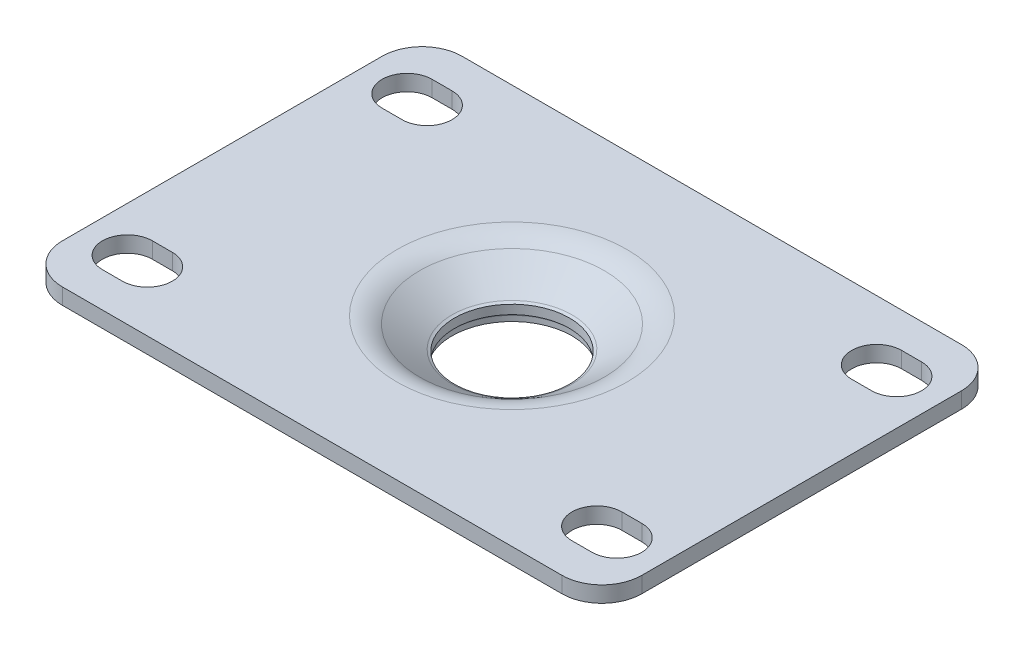
ISO-10303-21;
HEADER;
FILE_DESCRIPTION(('STEP AP214'),'2;1');
FILE_NAME('part.step','',(''),(''),'','','');
FILE_SCHEMA(('AUTOMOTIVE_DESIGN { 1 0 10303 214 1 1 1 1 }'));
ENDSEC;
DATA;
#1=APPLICATION_CONTEXT('core data for automotive mechanical design processes');
#2=APPLICATION_PROTOCOL_DEFINITION('international standard','automotive_design',2000,#1);
#3=PRODUCT_CONTEXT('',#1,'mechanical');
#4=PRODUCT('Part','Part','',(#3));
#5=PRODUCT_RELATED_PRODUCT_CATEGORY('part','',(#4));
#6=PRODUCT_DEFINITION_FORMATION('','',#4);
#7=PRODUCT_DEFINITION_CONTEXT('part definition',#1,'design');
#8=PRODUCT_DEFINITION('design','',#6,#7);
#9=PRODUCT_DEFINITION_SHAPE('','',#8);
#10=(LENGTH_UNIT() NAMED_UNIT(*) SI_UNIT(.MILLI.,.METRE.));
#11=(NAMED_UNIT(*) PLANE_ANGLE_UNIT() SI_UNIT($,.RADIAN.));
#12=(NAMED_UNIT(*) SI_UNIT($,.STERADIAN.) SOLID_ANGLE_UNIT());
#13=UNCERTAINTY_MEASURE_WITH_UNIT(LENGTH_MEASURE(1.E-05),#10,'distance_accuracy_value','');
#14=(GEOMETRIC_REPRESENTATION_CONTEXT(3) GLOBAL_UNCERTAINTY_ASSIGNED_CONTEXT((#13)) GLOBAL_UNIT_ASSIGNED_CONTEXT((#10,
#11,#12)) REPRESENTATION_CONTEXT('',''));
#15=CARTESIAN_POINT('',(0.,0.,0.));
#16=DIRECTION('',(0.,0.,1.));
#17=DIRECTION('',(1.,0.,0.));
#18=AXIS2_PLACEMENT_3D('',#15,#16,#17);
#19=CARTESIAN_POINT('',(19.304,69.85,0.));
#20=DIRECTION('',(0.,1.,0.));
#21=DIRECTION('',(0.,0.,1.));
#22=AXIS2_PLACEMENT_3D('',#19,#20,#21);
#23=PLANE('',#22);
#24=CARTESIAN_POINT('',(0.,69.85,0.));
#25=DIRECTION('',(0.,-1.,0.));
#26=DIRECTION('',(0.,0.,-1.));
#27=AXIS2_PLACEMENT_3D('',#24,#25,#26);
#28=CIRCLE('',#27,18.2626);
#29=CARTESIAN_POINT('',(0.,69.85,-18.2626));
#30=VERTEX_POINT('',#29);
#31=EDGE_CURVE('E11',#30,#30,#28,.T.);
#32=ORIENTED_EDGE('',*,*,#31,.T.);
#33=EDGE_LOOP('',(#32));
#34=FACE_BOUND('',#33,.T.);
#35=CARTESIAN_POINT('',(35.71875,69.85,-22.225));
#36=DIRECTION('',(0.,1.,0.));
#37=DIRECTION('',(0.,0.,-1.));
#38=AXIS2_PLACEMENT_3D('',#35,#36,#37);
#39=CIRCLE('',#38,3.96875);
#40=CARTESIAN_POINT('',(35.71875,69.85,-26.19375));
#41=VERTEX_POINT('',#40);
#42=CARTESIAN_POINT('',(35.71875,69.85,-18.25625));
#43=VERTEX_POINT('',#42);
#44=EDGE_CURVE('E239',#41,#43,#39,.T.);
#45=ORIENTED_EDGE('',*,*,#44,.F.);
#46=DIRECTION('',(-1.,0.,0.));
#47=VECTOR('',#46,1.);
#48=CARTESIAN_POINT('',(35.71875,69.85,-26.19375));
#49=LINE('',#48,#47);
#50=CARTESIAN_POINT('',(38.89375,69.85,-26.19375));
#51=VERTEX_POINT('',#50);
#52=EDGE_CURVE('E247',#51,#41,#49,.T.);
#53=ORIENTED_EDGE('',*,*,#52,.F.);
#54=CARTESIAN_POINT('',(38.89375,69.85,-22.225));
#55=DIRECTION('',(0.,1.,0.));
#56=DIRECTION('',(0.,0.,-1.));
#57=AXIS2_PLACEMENT_3D('',#54,#55,#56);
#58=CIRCLE('',#57,3.96875);
#59=CARTESIAN_POINT('',(38.89375,69.85,-18.25625));
#60=VERTEX_POINT('',#59);
#61=EDGE_CURVE('E244',#60,#51,#58,.T.);
#62=ORIENTED_EDGE('',*,*,#61,.F.);
#63=DIRECTION('',(1.,0.,0.));
#64=VECTOR('',#63,1.);
#65=CARTESIAN_POINT('',(38.89375,69.85,-18.25625));
#66=LINE('',#65,#64);
#67=EDGE_CURVE('E241',#43,#60,#66,.T.);
#68=ORIENTED_EDGE('',*,*,#67,.F.);
#69=EDGE_LOOP('',(#45,#53,#62,#68));
#70=FACE_BOUND('',#69,.T.);
#71=CARTESIAN_POINT('',(-38.89375,69.85,-22.225));
#72=DIRECTION('',(0.,1.,0.));
#73=DIRECTION('',(0.,0.,-1.));
#74=AXIS2_PLACEMENT_3D('',#71,#72,#73);
#75=CIRCLE('',#74,3.96875);
#76=CARTESIAN_POINT('',(-38.89375,69.85,-26.19375));
#77=VERTEX_POINT('',#76);
#78=CARTESIAN_POINT('',(-38.89375,69.85,-18.25625));
#79=VERTEX_POINT('',#78);
#80=EDGE_CURVE('E301',#77,#79,#75,.T.);
#81=ORIENTED_EDGE('',*,*,#80,.F.);
#82=DIRECTION('',(-1.,0.,0.));
#83=VECTOR('',#82,1.);
#84=CARTESIAN_POINT('',(-38.89375,69.85,-26.19375));
#85=LINE('',#84,#83);
#86=CARTESIAN_POINT('',(-35.71875,69.85,-26.19375));
#87=VERTEX_POINT('',#86);
#88=EDGE_CURVE('E309',#87,#77,#85,.T.);
#89=ORIENTED_EDGE('',*,*,#88,.F.);
#90=CARTESIAN_POINT('',(-35.71875,69.85,-22.225));
#91=DIRECTION('',(0.,1.,0.));
#92=DIRECTION('',(0.,0.,-1.));
#93=AXIS2_PLACEMENT_3D('',#90,#91,#92);
#94=CIRCLE('',#93,3.96875);
#95=CARTESIAN_POINT('',(-35.71875,69.85,-18.25625));
#96=VERTEX_POINT('',#95);
#97=EDGE_CURVE('E306',#96,#87,#94,.T.);
#98=ORIENTED_EDGE('',*,*,#97,.F.);
#99=DIRECTION('',(1.,0.,0.));
#100=VECTOR('',#99,1.);
#101=CARTESIAN_POINT('',(-35.71875,69.85,-18.25625));
#102=LINE('',#101,#100);
#103=EDGE_CURVE('E303',#79,#96,#102,.T.);
#104=ORIENTED_EDGE('',*,*,#103,.F.);
#105=EDGE_LOOP('',(#81,#89,#98,#104));
#106=FACE_BOUND('',#105,.T.);
#107=CARTESIAN_POINT('',(-39.6875,69.85,-25.4));
#108=DIRECTION('',(0.,1.,0.));
#109=DIRECTION('',(0.,0.,-1.));
#110=AXIS2_PLACEMENT_3D('',#107,#108,#109);
#111=CIRCLE('',#110,6.34999999999998);
#112=CARTESIAN_POINT('',(-39.6875,69.85,-31.75));
#113=VERTEX_POINT('',#112);
#114=CARTESIAN_POINT('',(-46.0375,69.85,-25.4));
#115=VERTEX_POINT('',#114);
#116=EDGE_CURVE('E332',#113,#115,#111,.T.);
#117=ORIENTED_EDGE('',*,*,#116,.T.);
#118=DIRECTION('',(0.,0.,1.));
#119=VECTOR('',#118,1.);
#120=CARTESIAN_POINT('',(-46.0375,69.85,25.4));
#121=LINE('',#120,#119);
#122=CARTESIAN_POINT('',(-46.0375,69.85,25.4));
#123=VERTEX_POINT('',#122);
#124=EDGE_CURVE('E335',#115,#123,#121,.T.);
#125=ORIENTED_EDGE('',*,*,#124,.T.);
#126=CARTESIAN_POINT('',(-39.6875,69.85,25.4));
#127=DIRECTION('',(0.,1.,0.));
#128=DIRECTION('',(0.,0.,-1.));
#129=AXIS2_PLACEMENT_3D('',#126,#127,#128);
#130=CIRCLE('',#129,6.34999999999998);
#131=CARTESIAN_POINT('',(-39.6875,69.85,31.75));
#132=VERTEX_POINT('',#131);
#133=EDGE_CURVE('E338',#123,#132,#130,.T.);
#134=ORIENTED_EDGE('',*,*,#133,.T.);
#135=DIRECTION('',(1.,0.,0.));
#136=VECTOR('',#135,1.);
#137=CARTESIAN_POINT('',(39.6875,69.85,31.75));
#138=LINE('',#137,#136);
#139=CARTESIAN_POINT('',(39.6875,69.85,31.75));
#140=VERTEX_POINT('',#139);
#141=EDGE_CURVE('E340',#132,#140,#138,.T.);
#142=ORIENTED_EDGE('',*,*,#141,.T.);
#143=CARTESIAN_POINT('',(39.6875,69.85,25.4));
#144=DIRECTION('',(0.,1.,0.));
#145=DIRECTION('',(0.,0.,-1.));
#146=AXIS2_PLACEMENT_3D('',#143,#144,#145);
#147=CIRCLE('',#146,6.34999999999998);
#148=CARTESIAN_POINT('',(46.0375,69.85,25.4));
#149=VERTEX_POINT('',#148);
#150=EDGE_CURVE('E342',#140,#149,#147,.T.);
#151=ORIENTED_EDGE('',*,*,#150,.T.);
#152=DIRECTION('',(0.,0.,-1.));
#153=VECTOR('',#152,1.);
#154=CARTESIAN_POINT('',(46.0375,69.85,-25.4));
#155=LINE('',#154,#153);
#156=CARTESIAN_POINT('',(46.0375,69.85,-25.4));
#157=VERTEX_POINT('',#156);
#158=EDGE_CURVE('E344',#149,#157,#155,.T.);
#159=ORIENTED_EDGE('',*,*,#158,.T.);
#160=CARTESIAN_POINT('',(39.6875,69.85,-25.4));
#161=DIRECTION('',(0.,1.,0.));
#162=DIRECTION('',(0.,0.,-1.));
#163=AXIS2_PLACEMENT_3D('',#160,#161,#162);
#164=CIRCLE('',#163,6.34999999999998);
#165=CARTESIAN_POINT('',(39.6875,69.85,-31.75));
#166=VERTEX_POINT('',#165);
#167=EDGE_CURVE('E346',#157,#166,#164,.T.);
#168=ORIENTED_EDGE('',*,*,#167,.T.);
#169=DIRECTION('',(-1.,0.,0.));
#170=VECTOR('',#169,1.);
#171=CARTESIAN_POINT('',(-39.6875,69.85,-31.75));
#172=LINE('',#171,#170);
#173=EDGE_CURVE('E348',#166,#113,#172,.T.);
#174=ORIENTED_EDGE('',*,*,#173,.T.);
#175=EDGE_LOOP('',(#117,#125,#134,#142,#151,#159,#168,#174));
#176=FACE_BOUND('',#175,.T.);
#177=CARTESIAN_POINT('',(-38.89375,69.85,22.225));
#178=DIRECTION('',(0.,1.,0.));
#179=DIRECTION('',(0.,0.,-1.));
#180=AXIS2_PLACEMENT_3D('',#177,#178,#179);
#181=CIRCLE('',#180,3.96875);
#182=CARTESIAN_POINT('',(-38.89375,69.85,18.25625));
#183=VERTEX_POINT('',#182);
#184=CARTESIAN_POINT('',(-38.89375,69.85,26.19375));
#185=VERTEX_POINT('',#184);
#186=EDGE_CURVE('E270',#183,#185,#181,.T.);
#187=ORIENTED_EDGE('',*,*,#186,.F.);
#188=DIRECTION('',(-1.,0.,0.));
#189=VECTOR('',#188,1.);
#190=CARTESIAN_POINT('',(-38.89375,69.85,18.25625));
#191=LINE('',#190,#189);
#192=CARTESIAN_POINT('',(-35.71875,69.85,18.25625));
#193=VERTEX_POINT('',#192);
#194=EDGE_CURVE('E278',#193,#183,#191,.T.);
#195=ORIENTED_EDGE('',*,*,#194,.F.);
#196=CARTESIAN_POINT('',(-35.71875,69.85,22.225));
#197=DIRECTION('',(0.,1.,0.));
#198=DIRECTION('',(0.,0.,-1.));
#199=AXIS2_PLACEMENT_3D('',#196,#197,#198);
#200=CIRCLE('',#199,3.96875);
#201=CARTESIAN_POINT('',(-35.71875,69.85,26.19375));
#202=VERTEX_POINT('',#201);
#203=EDGE_CURVE('E275',#202,#193,#200,.T.);
#204=ORIENTED_EDGE('',*,*,#203,.F.);
#205=DIRECTION('',(1.,0.,0.));
#206=VECTOR('',#205,1.);
#207=CARTESIAN_POINT('',(-35.71875,69.85,26.19375));
#208=LINE('',#207,#206);
#209=EDGE_CURVE('E272',#185,#202,#208,.T.);
#210=ORIENTED_EDGE('',*,*,#209,.F.);
#211=EDGE_LOOP('',(#187,#195,#204,#210));
#212=FACE_BOUND('',#211,.T.);
#213=CARTESIAN_POINT('',(35.71875,69.85,22.225));
#214=DIRECTION('',(0.,1.,0.));
#215=DIRECTION('',(0.,0.,-1.));
#216=AXIS2_PLACEMENT_3D('',#213,#214,#215);
#217=CIRCLE('',#216,3.96875);
#218=CARTESIAN_POINT('',(35.71875,69.85,18.25625));
#219=VERTEX_POINT('',#218);
#220=CARTESIAN_POINT('',(35.71875,69.85,26.19375));
#221=VERTEX_POINT('',#220);
#222=EDGE_CURVE('E203',#219,#221,#217,.T.);
#223=ORIENTED_EDGE('',*,*,#222,.F.);
#224=DIRECTION('',(-1.,0.,0.));
#225=VECTOR('',#224,1.);
#226=CARTESIAN_POINT('',(35.71875,69.85,18.25625));
#227=LINE('',#226,#225);
#228=CARTESIAN_POINT('',(38.89375,69.85,18.25625));
#229=VERTEX_POINT('',#228);
#230=EDGE_CURVE('E225',#229,#219,#227,.T.);
#231=ORIENTED_EDGE('',*,*,#230,.F.);
#232=CARTESIAN_POINT('',(38.89375,69.85,22.225));
#233=DIRECTION('',(0.,1.,0.));
#234=DIRECTION('',(0.,0.,-1.));
#235=AXIS2_PLACEMENT_3D('',#232,#233,#234);
#236=CIRCLE('',#235,3.96875);
#237=CARTESIAN_POINT('',(38.89375,69.85,26.19375));
#238=VERTEX_POINT('',#237);
#239=EDGE_CURVE('E223',#238,#229,#236,.T.);
#240=ORIENTED_EDGE('',*,*,#239,.F.);
#241=DIRECTION('',(1.,0.,0.));
#242=VECTOR('',#241,1.);
#243=CARTESIAN_POINT('',(38.89375,69.85,26.19375));
#244=LINE('',#243,#242);
#245=EDGE_CURVE('E211',#221,#238,#244,.T.);
#246=ORIENTED_EDGE('',*,*,#245,.F.);
#247=EDGE_LOOP('',(#223,#231,#240,#246));
#248=FACE_BOUND('',#247,.T.);
#249=ADVANCED_FACE('F43',(#34,#70,#106,#176,#212,#248),#23,.T.);
#250=CARTESIAN_POINT('',(0.,63.5067036743865,0.));
#251=DIRECTION('',(0.,-1.,0.));
#252=DIRECTION('',(0.,0.,-1.));
#253=AXIS2_PLACEMENT_3D('',#250,#251,#252);
#254=TOROIDAL_SURFACE('',#253,18.2615842384733,6.34329640694123);
#255=CARTESIAN_POINT('',(0.,68.73494,0.));
#256=DIRECTION('',(0.,-1.,0.));
#257=DIRECTION('',(0.,0.,-1.));
#258=AXIS2_PLACEMENT_3D('',#255,#256,#257);
#259=CIRCLE('',#258,14.669516);
#260=CARTESIAN_POINT('',(0.,68.73494,-14.669516));
#261=VERTEX_POINT('',#260);
#262=EDGE_CURVE('E50',#261,#261,#259,.T.);
#263=ORIENTED_EDGE('',*,*,#262,.T.);
#264=EDGE_LOOP('',(#263));
#265=FACE_BOUND('',#264,.T.);
#266=ORIENTED_EDGE('',*,*,#31,.F.);
#267=EDGE_LOOP('',(#266));
#268=FACE_BOUND('',#267,.T.);
#269=ADVANCED_FACE('F418',(#265,#268),#254,.T.);
#270=CARTESIAN_POINT('',(0.,68.73494,0.));
#271=DIRECTION('',(0.,1.,0.));
#272=DIRECTION('',(0.,0.,1.));
#273=AXIS2_PLACEMENT_3D('',#270,#271,#272);
#274=CONICAL_SURFACE('',#273,14.669516,0.969295415131203);
#275=CARTESIAN_POINT('',(0.,65.2145,0.));
#276=DIRECTION('',(0.,-1.,0.));
#277=DIRECTION('',(0.,0.,-1.));
#278=AXIS2_PLACEMENT_3D('',#275,#276,#277);
#279=CIRCLE('',#278,9.54024);
#280=CARTESIAN_POINT('',(0.,65.2145,-9.54024));
#281=VERTEX_POINT('',#280);
#282=EDGE_CURVE('E413',#281,#281,#279,.T.);
#283=ORIENTED_EDGE('',*,*,#282,.T.);
#284=EDGE_LOOP('',(#283));
#285=FACE_BOUND('',#284,.T.);
#286=ORIENTED_EDGE('',*,*,#262,.F.);
#287=EDGE_LOOP('',(#286));
#288=FACE_BOUND('',#287,.T.);
#289=ADVANCED_FACE('F421',(#285,#288),#274,.F.);
#290=CARTESIAN_POINT('',(0.,67.1278815066508,0.));
#291=DIRECTION('',(0.,-1.,0.));
#292=DIRECTION('',(0.,0.,-1.));
#293=AXIS2_PLACEMENT_3D('',#290,#291,#292);
#294=TOROIDAL_SURFACE('',#293,8.21557978824899,2.32717714551119);
#295=CARTESIAN_POINT('',(0.,64.98844,0.));
#296=DIRECTION('',(0.,-1.,0.));
#297=DIRECTION('',(0.,0.,-1.));
#298=AXIS2_PLACEMENT_3D('',#295,#296,#297);
#299=CIRCLE('',#298,9.1313);
#300=CARTESIAN_POINT('',(0.,64.98844,-9.1313));
#301=VERTEX_POINT('',#300);
#302=EDGE_CURVE('E410',#301,#301,#299,.T.);
#303=ORIENTED_EDGE('',*,*,#302,.T.);
#304=EDGE_LOOP('',(#303));
#305=FACE_BOUND('',#304,.T.);
#306=ORIENTED_EDGE('',*,*,#282,.F.);
#307=EDGE_LOOP('',(#306));
#308=FACE_BOUND('',#307,.T.);
#309=ADVANCED_FACE('F423',(#305,#308),#294,.F.);
#310=CARTESIAN_POINT('',(0.,-25.4,0.));
#311=DIRECTION('',(0.,-1.,0.));
#312=DIRECTION('',(0.,0.,-1.));
#313=AXIS2_PLACEMENT_3D('',#310,#311,#312);
#314=CYLINDRICAL_SURFACE('',#313,9.1313);
#315=CARTESIAN_POINT('',(0.,63.5508,0.));
#316=DIRECTION('',(0.,-1.,0.));
#317=DIRECTION('',(0.,0.,-1.));
#318=AXIS2_PLACEMENT_3D('',#315,#316,#317);
#319=CIRCLE('',#318,9.1313);
#320=CARTESIAN_POINT('',(0.,63.5508,-9.1313));
#321=VERTEX_POINT('',#320);
#322=EDGE_CURVE('E407',#321,#321,#319,.T.);
#323=ORIENTED_EDGE('',*,*,#322,.T.);
#324=EDGE_LOOP('',(#323));
#325=FACE_BOUND('',#324,.T.);
#326=ORIENTED_EDGE('',*,*,#302,.F.);
#327=EDGE_LOOP('',(#326));
#328=FACE_BOUND('',#327,.T.);
#329=ADVANCED_FACE('F430',(#325,#328),#314,.F.);
#330=CARTESIAN_POINT('',(9.1313,63.5508,0.));
#331=DIRECTION('',(0.,-1.,0.));
#332=DIRECTION('',(0.,0.,-1.));
#333=AXIS2_PLACEMENT_3D('',#330,#331,#332);
#334=PLANE('',#333);
#335=CARTESIAN_POINT('',(0.,63.5508,0.));
#336=DIRECTION('',(0.,-1.,0.));
#337=DIRECTION('',(0.,0.,-1.));
#338=AXIS2_PLACEMENT_3D('',#335,#336,#337);
#339=CIRCLE('',#338,9.1567);
#340=CARTESIAN_POINT('',(0.,63.5508,-9.1567));
#341=VERTEX_POINT('',#340);
#342=EDGE_CURVE('E404',#341,#341,#339,.T.);
#343=ORIENTED_EDGE('',*,*,#342,.T.);
#344=EDGE_LOOP('',(#343));
#345=FACE_BOUND('',#344,.T.);
#346=ORIENTED_EDGE('',*,*,#322,.F.);
#347=EDGE_LOOP('',(#346));
#348=FACE_BOUND('',#347,.T.);
#349=ADVANCED_FACE('F553',(#345,#348),#334,.T.);
#350=CARTESIAN_POINT('',(0.,63.1698,0.));
#351=DIRECTION('',(0.,-1.,0.));
#352=DIRECTION('',(0.,0.,-1.));
#353=AXIS2_PLACEMENT_3D('',#350,#351,#352);
#354=TOROIDAL_SURFACE('',#353,9.15669999999999,0.381000000000009);
#355=CARTESIAN_POINT('',(0.,63.1698,0.));
#356=DIRECTION('',(0.,-1.,0.));
#357=DIRECTION('',(0.,0.,-1.));
#358=AXIS2_PLACEMENT_3D('',#355,#356,#357);
#359=CIRCLE('',#358,9.5377);
#360=CARTESIAN_POINT('',(0.,63.1698,-9.5377));
#361=VERTEX_POINT('',#360);
#362=EDGE_CURVE('E401',#361,#361,#359,.T.);
#363=ORIENTED_EDGE('',*,*,#362,.T.);
#364=EDGE_LOOP('',(#363));
#365=FACE_BOUND('',#364,.T.);
#366=ORIENTED_EDGE('',*,*,#342,.F.);
#367=EDGE_LOOP('',(#366));
#368=FACE_BOUND('',#367,.T.);
#369=ADVANCED_FACE('F549',(#365,#368),#354,.F.);
#370=CARTESIAN_POINT('',(0.,-25.4,0.));
#371=DIRECTION('',(0.,-1.,0.));
#372=DIRECTION('',(0.,0.,-1.));
#373=AXIS2_PLACEMENT_3D('',#370,#371,#372);
#374=CYLINDRICAL_SURFACE('',#373,9.5377);
#375=CARTESIAN_POINT('',(0.,62.31382,0.));
#376=DIRECTION('',(0.,-1.,0.));
#377=DIRECTION('',(0.,0.,-1.));
#378=AXIS2_PLACEMENT_3D('',#375,#376,#377);
#379=CIRCLE('',#378,9.5377);
#380=CARTESIAN_POINT('',(0.,62.31382,-9.5377));
#381=VERTEX_POINT('',#380);
#382=EDGE_CURVE('E398',#381,#381,#379,.T.);
#383=ORIENTED_EDGE('',*,*,#382,.T.);
#384=EDGE_LOOP('',(#383));
#385=FACE_BOUND('',#384,.T.);
#386=ORIENTED_EDGE('',*,*,#362,.F.);
#387=EDGE_LOOP('',(#386));
#388=FACE_BOUND('',#387,.T.);
#389=ADVANCED_FACE('F545',(#385,#388),#374,.F.);
#390=CARTESIAN_POINT('',(0.,64.8058768731521,0.));
#391=DIRECTION('',(0.,-1.,0.));
#392=DIRECTION('',(0.,0.,-1.));
#393=AXIS2_PLACEMENT_3D('',#390,#391,#392);
#394=TOROIDAL_SURFACE('',#393,8.87715940196917,2.57811197209729);
#395=CARTESIAN_POINT('',(0.,62.6745,0.));
#396=DIRECTION('',(0.,-1.,0.));
#397=DIRECTION('',(0.,0.,-1.));
#398=AXIS2_PLACEMENT_3D('',#395,#396,#397);
#399=CIRCLE('',#398,10.32764);
#400=CARTESIAN_POINT('',(0.,62.6745,-10.32764));
#401=VERTEX_POINT('',#400);
#402=EDGE_CURVE('E395',#401,#401,#399,.T.);
#403=ORIENTED_EDGE('',*,*,#402,.T.);
#404=EDGE_LOOP('',(#403));
#405=FACE_BOUND('',#404,.T.);
#406=ORIENTED_EDGE('',*,*,#382,.F.);
#407=EDGE_LOOP('',(#406));
#408=FACE_BOUND('',#407,.T.);
#409=ADVANCED_FACE('F541',(#405,#408),#394,.T.);
#410=CARTESIAN_POINT('',(0.,62.6745,0.));
#411=DIRECTION('',(0.,1.,0.));
#412=DIRECTION('',(0.,0.,1.));
#413=AXIS2_PLACEMENT_3D('',#410,#411,#412);
#414=CONICAL_SURFACE('',#413,10.32764,0.969318518310585);
#415=CARTESIAN_POINT('',(0.,66.19494,0.));
#416=DIRECTION('',(0.,-1.,0.));
#417=DIRECTION('',(0.,0.,-1.));
#418=AXIS2_PLACEMENT_3D('',#415,#416,#417);
#419=CIRCLE('',#418,15.45717);
#420=CARTESIAN_POINT('',(0.,66.19494,-15.45717));
#421=VERTEX_POINT('',#420);
#422=EDGE_CURVE('E392',#421,#421,#419,.T.);
#423=ORIENTED_EDGE('',*,*,#422,.T.);
#424=EDGE_LOOP('',(#423));
#425=FACE_BOUND('',#424,.T.);
#426=ORIENTED_EDGE('',*,*,#402,.F.);
#427=EDGE_LOOP('',(#426));
#428=FACE_BOUND('',#427,.T.);
#429=ADVANCED_FACE('F537',(#425,#428),#414,.T.);
#430=CARTESIAN_POINT('',(0.,60.9524243235229,0.));
#431=DIRECTION('',(0.,-1.,0.));
#432=DIRECTION('',(0.,0.,-1.));
#433=AXIS2_PLACEMENT_3D('',#430,#431,#432);
#434=TOROIDAL_SURFACE('',#433,19.0536698723743,6.35757673568286);
#435=CARTESIAN_POINT('',(0.,67.31,0.));
#436=DIRECTION('',(0.,-1.,0.));
#437=DIRECTION('',(0.,0.,-1.));
#438=AXIS2_PLACEMENT_3D('',#435,#436,#437);
#439=CIRCLE('',#438,19.05);
#440=CARTESIAN_POINT('',(0.,67.31,-19.05));
#441=VERTEX_POINT('',#440);
#442=EDGE_CURVE('E389',#441,#441,#439,.T.);
#443=ORIENTED_EDGE('',*,*,#442,.T.);
#444=EDGE_LOOP('',(#443));
#445=FACE_BOUND('',#444,.T.);
#446=ORIENTED_EDGE('',*,*,#422,.F.);
#447=EDGE_LOOP('',(#446));
#448=FACE_BOUND('',#447,.T.);
#449=ADVANCED_FACE('F534',(#445,#448),#434,.F.);
#450=CARTESIAN_POINT('',(19.05,67.31,0.));
#451=DIRECTION('',(0.,-1.,0.));
#452=DIRECTION('',(0.,0.,-1.));
#453=AXIS2_PLACEMENT_3D('',#450,#451,#452);
#454=PLANE('',#453);
#455=ORIENTED_EDGE('',*,*,#442,.F.);
#456=EDGE_LOOP('',(#455));
#457=FACE_BOUND('',#456,.T.);
#458=CARTESIAN_POINT('',(-39.6875,67.31,-25.4));
#459=DIRECTION('',(0.,1.,0.));
#460=DIRECTION('',(0.,0.,-1.));
#461=AXIS2_PLACEMENT_3D('',#458,#459,#460);
#462=CIRCLE('',#461,6.34999999999998);
#463=CARTESIAN_POINT('',(-39.6875,67.31,-31.75));
#464=VERTEX_POINT('',#463);
#465=CARTESIAN_POINT('',(-46.0375,67.31,-25.4));
#466=VERTEX_POINT('',#465);
#467=EDGE_CURVE('E331',#464,#466,#462,.T.);
#468=ORIENTED_EDGE('',*,*,#467,.F.);
#469=DIRECTION('',(-1.,0.,0.));
#470=VECTOR('',#469,1.);
#471=CARTESIAN_POINT('',(-39.6875,67.31,-31.75));
#472=LINE('',#471,#470);
#473=CARTESIAN_POINT('',(39.6875,67.31,-31.75));
#474=VERTEX_POINT('',#473);
#475=EDGE_CURVE('E336',#474,#464,#472,.T.);
#476=ORIENTED_EDGE('',*,*,#475,.F.);
#477=CARTESIAN_POINT('',(39.6875,67.31,-25.4));
#478=DIRECTION('',(0.,1.,0.));
#479=DIRECTION('',(0.,0.,-1.));
#480=AXIS2_PLACEMENT_3D('',#477,#478,#479);
#481=CIRCLE('',#480,6.34999999999998);
#482=CARTESIAN_POINT('',(46.0375,67.31,-25.4));
#483=VERTEX_POINT('',#482);
#484=EDGE_CURVE('E363',#483,#474,#481,.T.);
#485=ORIENTED_EDGE('',*,*,#484,.F.);
#486=DIRECTION('',(0.,0.,-1.));
#487=VECTOR('',#486,1.);
#488=CARTESIAN_POINT('',(46.0375,67.31,-25.4));
#489=LINE('',#488,#487);
#490=CARTESIAN_POINT('',(46.0375,67.31,25.4));
#491=VERTEX_POINT('',#490);
#492=EDGE_CURVE('E361',#491,#483,#489,.T.);
#493=ORIENTED_EDGE('',*,*,#492,.F.);
#494=CARTESIAN_POINT('',(39.6875,67.31,25.4));
#495=DIRECTION('',(0.,1.,0.));
#496=DIRECTION('',(0.,0.,-1.));
#497=AXIS2_PLACEMENT_3D('',#494,#495,#496);
#498=CIRCLE('',#497,6.34999999999998);
#499=CARTESIAN_POINT('',(39.6875,67.31,31.75));
#500=VERTEX_POINT('',#499);
#501=EDGE_CURVE('E359',#500,#491,#498,.T.);
#502=ORIENTED_EDGE('',*,*,#501,.F.);
#503=DIRECTION('',(1.,0.,0.));
#504=VECTOR('',#503,1.);
#505=CARTESIAN_POINT('',(39.6875,67.31,31.75));
#506=LINE('',#505,#504);
#507=CARTESIAN_POINT('',(-39.6875,67.31,31.75));
#508=VERTEX_POINT('',#507);
#509=EDGE_CURVE('E357',#508,#500,#506,.T.);
#510=ORIENTED_EDGE('',*,*,#509,.F.);
#511=CARTESIAN_POINT('',(-39.6875,67.31,25.4));
#512=DIRECTION('',(0.,1.,0.));
#513=DIRECTION('',(0.,0.,-1.));
#514=AXIS2_PLACEMENT_3D('',#511,#512,#513);
#515=CIRCLE('',#514,6.34999999999998);
#516=CARTESIAN_POINT('',(-46.0375,67.31,25.4));
#517=VERTEX_POINT('',#516);
#518=EDGE_CURVE('E355',#517,#508,#515,.T.);
#519=ORIENTED_EDGE('',*,*,#518,.F.);
#520=DIRECTION('',(0.,0.,1.));
#521=VECTOR('',#520,1.);
#522=CARTESIAN_POINT('',(-46.0375,67.31,25.4));
#523=LINE('',#522,#521);
#524=EDGE_CURVE('E353',#466,#517,#523,.T.);
#525=ORIENTED_EDGE('',*,*,#524,.F.);
#526=EDGE_LOOP('',(#468,#476,#485,#493,#502,#510,#519,#525));
#527=FACE_BOUND('',#526,.T.);
#528=DIRECTION('',(-1.,0.,0.));
#529=VECTOR('',#528,1.);
#530=CARTESIAN_POINT('',(-38.89375,67.31,-26.19375));
#531=LINE('',#530,#529);
#532=CARTESIAN_POINT('',(-35.71875,67.31,-26.19375));
#533=VERTEX_POINT('',#532);
#534=CARTESIAN_POINT('',(-38.89375,67.31,-26.19375));
#535=VERTEX_POINT('',#534);
#536=EDGE_CURVE('E304',#533,#535,#531,.T.);
#537=ORIENTED_EDGE('',*,*,#536,.T.);
#538=CARTESIAN_POINT('',(-38.89375,67.31,-22.225));
#539=DIRECTION('',(0.,1.,0.));
#540=DIRECTION('',(0.,0.,-1.));
#541=AXIS2_PLACEMENT_3D('',#538,#539,#540);
#542=CIRCLE('',#541,3.96875);
#543=CARTESIAN_POINT('',(-38.89375,67.31,-18.25625));
#544=VERTEX_POINT('',#543);
#545=EDGE_CURVE('E300',#535,#544,#542,.T.);
#546=ORIENTED_EDGE('',*,*,#545,.T.);
#547=DIRECTION('',(1.,0.,0.));
#548=VECTOR('',#547,1.);
#549=CARTESIAN_POINT('',(-35.71875,67.31,-18.25625));
#550=LINE('',#549,#548);
#551=CARTESIAN_POINT('',(-35.71875,67.31,-18.25625));
#552=VERTEX_POINT('',#551);
#553=EDGE_CURVE('E314',#544,#552,#550,.T.);
#554=ORIENTED_EDGE('',*,*,#553,.T.);
#555=CARTESIAN_POINT('',(-35.71875,67.31,-22.225));
#556=DIRECTION('',(0.,1.,0.));
#557=DIRECTION('',(0.,0.,-1.));
#558=AXIS2_PLACEMENT_3D('',#555,#556,#557);
#559=CIRCLE('',#558,3.96875);
#560=EDGE_CURVE('E317',#552,#533,#559,.T.);
#561=ORIENTED_EDGE('',*,*,#560,.T.);
#562=EDGE_LOOP('',(#537,#546,#554,#561));
#563=FACE_BOUND('',#562,.T.);
#564=DIRECTION('',(-1.,0.,0.));
#565=VECTOR('',#564,1.);
#566=CARTESIAN_POINT('',(-38.89375,67.31,18.25625));
#567=LINE('',#566,#565);
#568=CARTESIAN_POINT('',(-35.71875,67.31,18.25625));
#569=VERTEX_POINT('',#568);
#570=CARTESIAN_POINT('',(-38.89375,67.31,18.25625));
#571=VERTEX_POINT('',#570);
#572=EDGE_CURVE('E273',#569,#571,#567,.T.);
#573=ORIENTED_EDGE('',*,*,#572,.T.);
#574=CARTESIAN_POINT('',(-38.89375,67.31,22.225));
#575=DIRECTION('',(0.,1.,0.));
#576=DIRECTION('',(0.,0.,-1.));
#577=AXIS2_PLACEMENT_3D('',#574,#575,#576);
#578=CIRCLE('',#577,3.96875);
#579=CARTESIAN_POINT('',(-38.89375,67.31,26.19375));
#580=VERTEX_POINT('',#579);
#581=EDGE_CURVE('E269',#571,#580,#578,.T.);
#582=ORIENTED_EDGE('',*,*,#581,.T.);
#583=DIRECTION('',(1.,0.,0.));
#584=VECTOR('',#583,1.);
#585=CARTESIAN_POINT('',(-35.71875,67.31,26.19375));
#586=LINE('',#585,#584);
#587=CARTESIAN_POINT('',(-35.71875,67.31,26.19375));
#588=VERTEX_POINT('',#587);
#589=EDGE_CURVE('E283',#580,#588,#586,.T.);
#590=ORIENTED_EDGE('',*,*,#589,.T.);
#591=CARTESIAN_POINT('',(-35.71875,67.31,22.225));
#592=DIRECTION('',(0.,1.,0.));
#593=DIRECTION('',(0.,0.,-1.));
#594=AXIS2_PLACEMENT_3D('',#591,#592,#593);
#595=CIRCLE('',#594,3.96875);
#596=EDGE_CURVE('E286',#588,#569,#595,.T.);
#597=ORIENTED_EDGE('',*,*,#596,.T.);
#598=EDGE_LOOP('',(#573,#582,#590,#597));
#599=FACE_BOUND('',#598,.T.);
#600=DIRECTION('',(-1.,0.,0.));
#601=VECTOR('',#600,1.);
#602=CARTESIAN_POINT('',(35.71875,67.31,-26.19375));
#603=LINE('',#602,#601);
#604=CARTESIAN_POINT('',(38.89375,67.31,-26.19375));
#605=VERTEX_POINT('',#604);
#606=CARTESIAN_POINT('',(35.71875,67.31,-26.19375));
#607=VERTEX_POINT('',#606);
#608=EDGE_CURVE('E242',#605,#607,#603,.T.);
#609=ORIENTED_EDGE('',*,*,#608,.T.);
#610=CARTESIAN_POINT('',(35.71875,67.31,-22.225));
#611=DIRECTION('',(0.,1.,0.));
#612=DIRECTION('',(0.,0.,-1.));
#613=AXIS2_PLACEMENT_3D('',#610,#611,#612);
#614=CIRCLE('',#613,3.96875);
#615=CARTESIAN_POINT('',(35.71875,67.31,-18.25625));
#616=VERTEX_POINT('',#615);
#617=EDGE_CURVE('E219',#607,#616,#614,.T.);
#618=ORIENTED_EDGE('',*,*,#617,.T.);
#619=DIRECTION('',(1.,0.,0.));
#620=VECTOR('',#619,1.);
#621=CARTESIAN_POINT('',(38.89375,67.31,-18.25625));
#622=LINE('',#621,#620);
#623=CARTESIAN_POINT('',(38.89375,67.31,-18.25625));
#624=VERTEX_POINT('',#623);
#625=EDGE_CURVE('E252',#616,#624,#622,.T.);
#626=ORIENTED_EDGE('',*,*,#625,.T.);
#627=CARTESIAN_POINT('',(38.89375,67.31,-22.225));
#628=DIRECTION('',(0.,1.,0.));
#629=DIRECTION('',(0.,0.,-1.));
#630=AXIS2_PLACEMENT_3D('',#627,#628,#629);
#631=CIRCLE('',#630,3.96875);
#632=EDGE_CURVE('E255',#624,#605,#631,.T.);
#633=ORIENTED_EDGE('',*,*,#632,.T.);
#634=EDGE_LOOP('',(#609,#618,#626,#633));
#635=FACE_BOUND('',#634,.T.);
#636=DIRECTION('',(-1.,0.,0.));
#637=VECTOR('',#636,1.);
#638=CARTESIAN_POINT('',(35.71875,67.31,18.25625));
#639=LINE('',#638,#637);
#640=CARTESIAN_POINT('',(38.89375,67.31,18.25625));
#641=VERTEX_POINT('',#640);
#642=CARTESIAN_POINT('',(35.71875,67.31,18.25625));
#643=VERTEX_POINT('',#642);
#644=EDGE_CURVE('E212',#641,#643,#639,.T.);
#645=ORIENTED_EDGE('',*,*,#644,.T.);
#646=CARTESIAN_POINT('',(35.71875,67.31,22.225));
#647=DIRECTION('',(0.,1.,0.));
#648=DIRECTION('',(0.,0.,-1.));
#649=AXIS2_PLACEMENT_3D('',#646,#647,#648);
#650=CIRCLE('',#649,3.96875);
#651=CARTESIAN_POINT('',(35.71875,67.31,26.19375));
#652=VERTEX_POINT('',#651);
#653=EDGE_CURVE('E65',#643,#652,#650,.T.);
#654=ORIENTED_EDGE('',*,*,#653,.T.);
#655=DIRECTION('',(1.,0.,0.));
#656=VECTOR('',#655,1.);
#657=CARTESIAN_POINT('',(38.89375,67.31,26.19375));
#658=LINE('',#657,#656);
#659=CARTESIAN_POINT('',(38.89375,67.31,26.19375));
#660=VERTEX_POINT('',#659);
#661=EDGE_CURVE('E218',#652,#660,#658,.T.);
#662=ORIENTED_EDGE('',*,*,#661,.T.);
#663=CARTESIAN_POINT('',(38.89375,67.31,22.225));
#664=DIRECTION('',(0.,1.,0.));
#665=DIRECTION('',(0.,0.,-1.));
#666=AXIS2_PLACEMENT_3D('',#663,#664,#665);
#667=CIRCLE('',#666,3.96875);
#668=EDGE_CURVE('E231',#660,#641,#667,.T.);
#669=ORIENTED_EDGE('',*,*,#668,.T.);
#670=EDGE_LOOP('',(#645,#654,#662,#669));
#671=FACE_BOUND('',#670,.T.);
#672=ADVANCED_FACE('F465',(#457,#527,#563,#599,#635,#671),#454,.T.);
#673=CARTESIAN_POINT('',(-39.6875,69.85,-25.4));
#674=DIRECTION('',(0.,-1.,0.));
#675=DIRECTION('',(0.,0.,-1.));
#676=AXIS2_PLACEMENT_3D('',#673,#674,#675);
#677=CYLINDRICAL_SURFACE('',#676,6.34999999999998);
#678=ORIENTED_EDGE('',*,*,#467,.T.);
#679=DIRECTION('',(0.,-1.,0.));
#680=VECTOR('',#679,1.);
#681=CARTESIAN_POINT('',(-46.0375,69.85,-25.4));
#682=LINE('',#681,#680);
#683=EDGE_CURVE('E386',#115,#466,#682,.T.);
#684=ORIENTED_EDGE('',*,*,#683,.F.);
#685=ORIENTED_EDGE('',*,*,#116,.F.);
#686=DIRECTION('',(0.,-1.,0.));
#687=VECTOR('',#686,1.);
#688=CARTESIAN_POINT('',(-39.6875,69.85,-31.75));
#689=LINE('',#688,#687);
#690=EDGE_CURVE('E350',#113,#464,#689,.T.);
#691=ORIENTED_EDGE('',*,*,#690,.T.);
#692=EDGE_LOOP('',(#678,#684,#685,#691));
#693=FACE_BOUND('',#692,.T.);
#694=ADVANCED_FACE('F528',(#693),#677,.T.);
#695=CARTESIAN_POINT('',(-46.0375,69.85,25.4));
#696=DIRECTION('',(1.,0.,0.));
#697=DIRECTION('',(0.,0.,-1.));
#698=AXIS2_PLACEMENT_3D('',#695,#696,#697);
#699=PLANE('',#698);
#700=ORIENTED_EDGE('',*,*,#524,.T.);
#701=DIRECTION('',(0.,-1.,0.));
#702=VECTOR('',#701,1.);
#703=CARTESIAN_POINT('',(-46.0375,69.85,25.4));
#704=LINE('',#703,#702);
#705=EDGE_CURVE('E383',#123,#517,#704,.T.);
#706=ORIENTED_EDGE('',*,*,#705,.F.);
#707=ORIENTED_EDGE('',*,*,#124,.F.);
#708=ORIENTED_EDGE('',*,*,#683,.T.);
#709=EDGE_LOOP('',(#700,#706,#707,#708));
#710=FACE_BOUND('',#709,.T.);
#711=ADVANCED_FACE('F524',(#710),#699,.F.);
#712=CARTESIAN_POINT('',(-39.6875,69.85,25.4));
#713=DIRECTION('',(0.,-1.,0.));
#714=DIRECTION('',(0.,0.,-1.));
#715=AXIS2_PLACEMENT_3D('',#712,#713,#714);
#716=CYLINDRICAL_SURFACE('',#715,6.34999999999998);
#717=ORIENTED_EDGE('',*,*,#518,.T.);
#718=DIRECTION('',(0.,-1.,0.));
#719=VECTOR('',#718,1.);
#720=CARTESIAN_POINT('',(-39.6875,69.85,31.75));
#721=LINE('',#720,#719);
#722=EDGE_CURVE('E380',#132,#508,#721,.T.);
#723=ORIENTED_EDGE('',*,*,#722,.F.);
#724=ORIENTED_EDGE('',*,*,#133,.F.);
#725=ORIENTED_EDGE('',*,*,#705,.T.);
#726=EDGE_LOOP('',(#717,#723,#724,#725));
#727=FACE_BOUND('',#726,.T.);
#728=ADVANCED_FACE('F520',(#727),#716,.T.);
#729=CARTESIAN_POINT('',(39.6875,69.85,31.75));
#730=DIRECTION('',(0.,0.,-1.));
#731=DIRECTION('',(-1.,0.,0.));
#732=AXIS2_PLACEMENT_3D('',#729,#730,#731);
#733=PLANE('',#732);
#734=ORIENTED_EDGE('',*,*,#509,.T.);
#735=DIRECTION('',(0.,-1.,0.));
#736=VECTOR('',#735,1.);
#737=CARTESIAN_POINT('',(39.6875,69.85,31.75));
#738=LINE('',#737,#736);
#739=EDGE_CURVE('E377',#140,#500,#738,.T.);
#740=ORIENTED_EDGE('',*,*,#739,.F.);
#741=ORIENTED_EDGE('',*,*,#141,.F.);
#742=ORIENTED_EDGE('',*,*,#722,.T.);
#743=EDGE_LOOP('',(#734,#740,#741,#742));
#744=FACE_BOUND('',#743,.T.);
#745=ADVANCED_FACE('F516',(#744),#733,.F.);
#746=CARTESIAN_POINT('',(39.6875,69.85,25.4));
#747=DIRECTION('',(0.,-1.,0.));
#748=DIRECTION('',(0.,0.,-1.));
#749=AXIS2_PLACEMENT_3D('',#746,#747,#748);
#750=CYLINDRICAL_SURFACE('',#749,6.34999999999998);
#751=ORIENTED_EDGE('',*,*,#501,.T.);
#752=DIRECTION('',(0.,-1.,0.));
#753=VECTOR('',#752,1.);
#754=CARTESIAN_POINT('',(46.0375,69.85,25.4));
#755=LINE('',#754,#753);
#756=EDGE_CURVE('E374',#149,#491,#755,.T.);
#757=ORIENTED_EDGE('',*,*,#756,.F.);
#758=ORIENTED_EDGE('',*,*,#150,.F.);
#759=ORIENTED_EDGE('',*,*,#739,.T.);
#760=EDGE_LOOP('',(#751,#757,#758,#759));
#761=FACE_BOUND('',#760,.T.);
#762=ADVANCED_FACE('F512',(#761),#750,.T.);
#763=CARTESIAN_POINT('',(46.0375,69.85,-25.4));
#764=DIRECTION('',(-1.,0.,0.));
#765=DIRECTION('',(0.,0.,1.));
#766=AXIS2_PLACEMENT_3D('',#763,#764,#765);
#767=PLANE('',#766);
#768=ORIENTED_EDGE('',*,*,#492,.T.);
#769=DIRECTION('',(0.,-1.,0.));
#770=VECTOR('',#769,1.);
#771=CARTESIAN_POINT('',(46.0375,69.85,-25.4));
#772=LINE('',#771,#770);
#773=EDGE_CURVE('E371',#157,#483,#772,.T.);
#774=ORIENTED_EDGE('',*,*,#773,.F.);
#775=ORIENTED_EDGE('',*,*,#158,.F.);
#776=ORIENTED_EDGE('',*,*,#756,.T.);
#777=EDGE_LOOP('',(#768,#774,#775,#776));
#778=FACE_BOUND('',#777,.T.);
#779=ADVANCED_FACE('F508',(#778),#767,.F.);
#780=CARTESIAN_POINT('',(39.6875,69.85,-25.4));
#781=DIRECTION('',(0.,-1.,0.));
#782=DIRECTION('',(0.,0.,-1.));
#783=AXIS2_PLACEMENT_3D('',#780,#781,#782);
#784=CYLINDRICAL_SURFACE('',#783,6.34999999999998);
#785=ORIENTED_EDGE('',*,*,#484,.T.);
#786=DIRECTION('',(0.,-1.,0.));
#787=VECTOR('',#786,1.);
#788=CARTESIAN_POINT('',(39.6875,69.85,-31.75));
#789=LINE('',#788,#787);
#790=EDGE_CURVE('E368',#166,#474,#789,.T.);
#791=ORIENTED_EDGE('',*,*,#790,.F.);
#792=ORIENTED_EDGE('',*,*,#167,.F.);
#793=ORIENTED_EDGE('',*,*,#773,.T.);
#794=EDGE_LOOP('',(#785,#791,#792,#793));
#795=FACE_BOUND('',#794,.T.);
#796=ADVANCED_FACE('F504',(#795),#784,.T.);
#797=CARTESIAN_POINT('',(-39.6875,69.85,-31.75));
#798=DIRECTION('',(0.,0.,1.));
#799=DIRECTION('',(1.,0.,0.));
#800=AXIS2_PLACEMENT_3D('',#797,#798,#799);
#801=PLANE('',#800);
#802=ORIENTED_EDGE('',*,*,#475,.T.);
#803=ORIENTED_EDGE('',*,*,#690,.F.);
#804=ORIENTED_EDGE('',*,*,#173,.F.);
#805=ORIENTED_EDGE('',*,*,#790,.T.);
#806=EDGE_LOOP('',(#802,#803,#804,#805));
#807=FACE_BOUND('',#806,.T.);
#808=ADVANCED_FACE('F500',(#807),#801,.F.);
#809=CARTESIAN_POINT('',(-38.89375,69.85,-22.225));
#810=DIRECTION('',(0.,-1.,0.));
#811=DIRECTION('',(0.,0.,-1.));
#812=AXIS2_PLACEMENT_3D('',#809,#810,#811);
#813=CYLINDRICAL_SURFACE('',#812,3.96875);
#814=ORIENTED_EDGE('',*,*,#545,.F.);
#815=DIRECTION('',(0.,-1.,0.));
#816=VECTOR('',#815,1.);
#817=CARTESIAN_POINT('',(-38.89375,69.85,-26.19375));
#818=LINE('',#817,#816);
#819=EDGE_CURVE('E311',#77,#535,#818,.T.);
#820=ORIENTED_EDGE('',*,*,#819,.F.);
#821=ORIENTED_EDGE('',*,*,#80,.T.);
#822=DIRECTION('',(0.,-1.,0.));
#823=VECTOR('',#822,1.);
#824=CARTESIAN_POINT('',(-38.89375,69.85,-18.25625));
#825=LINE('',#824,#823);
#826=EDGE_CURVE('E328',#79,#544,#825,.T.);
#827=ORIENTED_EDGE('',*,*,#826,.T.);
#828=EDGE_LOOP('',(#814,#820,#821,#827));
#829=FACE_BOUND('',#828,.T.);
#830=ADVANCED_FACE('F496',(#829),#813,.F.);
#831=CARTESIAN_POINT('',(-35.71875,69.85,-18.25625));
#832=DIRECTION('',(0.,0.,-1.));
#833=DIRECTION('',(-1.,0.,0.));
#834=AXIS2_PLACEMENT_3D('',#831,#832,#833);
#835=PLANE('',#834);
#836=ORIENTED_EDGE('',*,*,#553,.F.);
#837=ORIENTED_EDGE('',*,*,#826,.F.);
#838=ORIENTED_EDGE('',*,*,#103,.T.);
#839=DIRECTION('',(0.,-1.,0.));
#840=VECTOR('',#839,1.);
#841=CARTESIAN_POINT('',(-35.71875,69.85,-18.25625));
#842=LINE('',#841,#840);
#843=EDGE_CURVE('E326',#96,#552,#842,.T.);
#844=ORIENTED_EDGE('',*,*,#843,.T.);
#845=EDGE_LOOP('',(#836,#837,#838,#844));
#846=FACE_BOUND('',#845,.T.);
#847=ADVANCED_FACE('F492',(#846),#835,.T.);
#848=CARTESIAN_POINT('',(-35.71875,69.85,-22.225));
#849=DIRECTION('',(0.,-1.,0.));
#850=DIRECTION('',(0.,0.,-1.));
#851=AXIS2_PLACEMENT_3D('',#848,#849,#850);
#852=CYLINDRICAL_SURFACE('',#851,3.96875);
#853=ORIENTED_EDGE('',*,*,#560,.F.);
#854=ORIENTED_EDGE('',*,*,#843,.F.);
#855=ORIENTED_EDGE('',*,*,#97,.T.);
#856=DIRECTION('',(0.,-1.,0.));
#857=VECTOR('',#856,1.);
#858=CARTESIAN_POINT('',(-35.71875,69.85,-26.19375));
#859=LINE('',#858,#857);
#860=EDGE_CURVE('E324',#87,#533,#859,.T.);
#861=ORIENTED_EDGE('',*,*,#860,.T.);
#862=EDGE_LOOP('',(#853,#854,#855,#861));
#863=FACE_BOUND('',#862,.T.);
#864=ADVANCED_FACE('F488',(#863),#852,.F.);
#865=CARTESIAN_POINT('',(-38.89375,69.85,-26.19375));
#866=DIRECTION('',(0.,0.,1.));
#867=DIRECTION('',(1.,0.,0.));
#868=AXIS2_PLACEMENT_3D('',#865,#866,#867);
#869=PLANE('',#868);
#870=ORIENTED_EDGE('',*,*,#536,.F.);
#871=ORIENTED_EDGE('',*,*,#860,.F.);
#872=ORIENTED_EDGE('',*,*,#88,.T.);
#873=ORIENTED_EDGE('',*,*,#819,.T.);
#874=EDGE_LOOP('',(#870,#871,#872,#873));
#875=FACE_BOUND('',#874,.T.);
#876=ADVANCED_FACE('F485',(#875),#869,.T.);
#877=CARTESIAN_POINT('',(-38.89375,69.85,22.225));
#878=DIRECTION('',(0.,-1.,0.));
#879=DIRECTION('',(0.,0.,-1.));
#880=AXIS2_PLACEMENT_3D('',#877,#878,#879);
#881=CYLINDRICAL_SURFACE('',#880,3.96875);
#882=ORIENTED_EDGE('',*,*,#581,.F.);
#883=DIRECTION('',(0.,-1.,0.));
#884=VECTOR('',#883,1.);
#885=CARTESIAN_POINT('',(-38.89375,69.85,18.25625));
#886=LINE('',#885,#884);
#887=EDGE_CURVE('E280',#183,#571,#886,.T.);
#888=ORIENTED_EDGE('',*,*,#887,.F.);
#889=ORIENTED_EDGE('',*,*,#186,.T.);
#890=DIRECTION('',(0.,-1.,0.));
#891=VECTOR('',#890,1.);
#892=CARTESIAN_POINT('',(-38.89375,69.85,26.19375));
#893=LINE('',#892,#891);
#894=EDGE_CURVE('E297',#185,#580,#893,.T.);
#895=ORIENTED_EDGE('',*,*,#894,.T.);
#896=EDGE_LOOP('',(#882,#888,#889,#895));
#897=FACE_BOUND('',#896,.T.);
#898=ADVANCED_FACE('F459',(#897),#881,.F.);
#899=CARTESIAN_POINT('',(-35.71875,69.85,26.19375));
#900=DIRECTION('',(0.,0.,-1.));
#901=DIRECTION('',(-1.,0.,0.));
#902=AXIS2_PLACEMENT_3D('',#899,#900,#901);
#903=PLANE('',#902);
#904=ORIENTED_EDGE('',*,*,#589,.F.);
#905=ORIENTED_EDGE('',*,*,#894,.F.);
#906=ORIENTED_EDGE('',*,*,#209,.T.);
#907=DIRECTION('',(0.,-1.,0.));
#908=VECTOR('',#907,1.);
#909=CARTESIAN_POINT('',(-35.71875,69.85,26.19375));
#910=LINE('',#909,#908);
#911=EDGE_CURVE('E295',#202,#588,#910,.T.);
#912=ORIENTED_EDGE('',*,*,#911,.T.);
#913=EDGE_LOOP('',(#904,#905,#906,#912));
#914=FACE_BOUND('',#913,.T.);
#915=ADVANCED_FACE('F461',(#914),#903,.T.);
#916=CARTESIAN_POINT('',(-35.71875,69.85,22.225));
#917=DIRECTION('',(0.,-1.,0.));
#918=DIRECTION('',(0.,0.,-1.));
#919=AXIS2_PLACEMENT_3D('',#916,#917,#918);
#920=CYLINDRICAL_SURFACE('',#919,3.96875);
#921=ORIENTED_EDGE('',*,*,#596,.F.);
#922=ORIENTED_EDGE('',*,*,#911,.F.);
#923=ORIENTED_EDGE('',*,*,#203,.T.);
#924=DIRECTION('',(0.,-1.,0.));
#925=VECTOR('',#924,1.);
#926=CARTESIAN_POINT('',(-35.71875,69.85,18.25625));
#927=LINE('',#926,#925);
#928=EDGE_CURVE('E293',#193,#569,#927,.T.);
#929=ORIENTED_EDGE('',*,*,#928,.T.);
#930=EDGE_LOOP('',(#921,#922,#923,#929));
#931=FACE_BOUND('',#930,.T.);
#932=ADVANCED_FACE('F471',(#931),#920,.F.);
#933=CARTESIAN_POINT('',(-38.89375,69.85,18.25625));
#934=DIRECTION('',(0.,0.,1.));
#935=DIRECTION('',(1.,0.,0.));
#936=AXIS2_PLACEMENT_3D('',#933,#934,#935);
#937=PLANE('',#936);
#938=ORIENTED_EDGE('',*,*,#572,.F.);
#939=ORIENTED_EDGE('',*,*,#928,.F.);
#940=ORIENTED_EDGE('',*,*,#194,.T.);
#941=ORIENTED_EDGE('',*,*,#887,.T.);
#942=EDGE_LOOP('',(#938,#939,#940,#941));
#943=FACE_BOUND('',#942,.T.);
#944=ADVANCED_FACE('F469',(#943),#937,.T.);
#945=CARTESIAN_POINT('',(35.71875,69.85,-22.225));
#946=DIRECTION('',(0.,-1.,0.));
#947=DIRECTION('',(0.,0.,-1.));
#948=AXIS2_PLACEMENT_3D('',#945,#946,#947);
#949=CYLINDRICAL_SURFACE('',#948,3.96875);
#950=ORIENTED_EDGE('',*,*,#617,.F.);
#951=DIRECTION('',(0.,-1.,0.));
#952=VECTOR('',#951,1.);
#953=CARTESIAN_POINT('',(35.71875,69.85,-26.19375));
#954=LINE('',#953,#952);
#955=EDGE_CURVE('E249',#41,#607,#954,.T.);
#956=ORIENTED_EDGE('',*,*,#955,.F.);
#957=ORIENTED_EDGE('',*,*,#44,.T.);
#958=DIRECTION('',(0.,-1.,0.));
#959=VECTOR('',#958,1.);
#960=CARTESIAN_POINT('',(35.71875,69.85,-18.25625));
#961=LINE('',#960,#959);
#962=EDGE_CURVE('E266',#43,#616,#961,.T.);
#963=ORIENTED_EDGE('',*,*,#962,.T.);
#964=EDGE_LOOP('',(#950,#956,#957,#963));
#965=FACE_BOUND('',#964,.T.);
#966=ADVANCED_FACE('F478',(#965),#949,.F.);
#967=CARTESIAN_POINT('',(38.89375,69.85,-18.25625));
#968=DIRECTION('',(0.,0.,-1.));
#969=DIRECTION('',(-1.,0.,0.));
#970=AXIS2_PLACEMENT_3D('',#967,#968,#969);
#971=PLANE('',#970);
#972=ORIENTED_EDGE('',*,*,#625,.F.);
#973=ORIENTED_EDGE('',*,*,#962,.F.);
#974=ORIENTED_EDGE('',*,*,#67,.T.);
#975=DIRECTION('',(0.,-1.,0.));
#976=VECTOR('',#975,1.);
#977=CARTESIAN_POINT('',(38.89375,69.85,-18.25625));
#978=LINE('',#977,#976);
#979=EDGE_CURVE('E264',#60,#624,#978,.T.);
#980=ORIENTED_EDGE('',*,*,#979,.T.);
#981=EDGE_LOOP('',(#972,#973,#974,#980));
#982=FACE_BOUND('',#981,.T.);
#983=ADVANCED_FACE('F740',(#982),#971,.T.);
#984=CARTESIAN_POINT('',(38.89375,69.85,-22.225));
#985=DIRECTION('',(0.,-1.,0.));
#986=DIRECTION('',(0.,0.,-1.));
#987=AXIS2_PLACEMENT_3D('',#984,#985,#986);
#988=CYLINDRICAL_SURFACE('',#987,3.96875);
#989=ORIENTED_EDGE('',*,*,#632,.F.);
#990=ORIENTED_EDGE('',*,*,#979,.F.);
#991=ORIENTED_EDGE('',*,*,#61,.T.);
#992=DIRECTION('',(0.,-1.,0.));
#993=VECTOR('',#992,1.);
#994=CARTESIAN_POINT('',(38.89375,69.85,-26.19375));
#995=LINE('',#994,#993);
#996=EDGE_CURVE('E262',#51,#605,#995,.T.);
#997=ORIENTED_EDGE('',*,*,#996,.T.);
#998=EDGE_LOOP('',(#989,#990,#991,#997));
#999=FACE_BOUND('',#998,.T.);
#1000=ADVANCED_FACE('F749',(#999),#988,.F.);
#1001=CARTESIAN_POINT('',(35.71875,69.85,-26.19375));
#1002=DIRECTION('',(0.,0.,1.));
#1003=DIRECTION('',(1.,0.,0.));
#1004=AXIS2_PLACEMENT_3D('',#1001,#1002,#1003);
#1005=PLANE('',#1004);
#1006=ORIENTED_EDGE('',*,*,#608,.F.);
#1007=ORIENTED_EDGE('',*,*,#996,.F.);
#1008=ORIENTED_EDGE('',*,*,#52,.T.);
#1009=ORIENTED_EDGE('',*,*,#955,.T.);
#1010=EDGE_LOOP('',(#1006,#1007,#1008,#1009));
#1011=FACE_BOUND('',#1010,.T.);
#1012=ADVANCED_FACE('F759',(#1011),#1005,.T.);
#1013=CARTESIAN_POINT('',(35.71875,69.85,22.225));
#1014=DIRECTION('',(0.,-1.,0.));
#1015=DIRECTION('',(0.,0.,-1.));
#1016=AXIS2_PLACEMENT_3D('',#1013,#1014,#1015);
#1017=CYLINDRICAL_SURFACE('',#1016,3.96875);
#1018=ORIENTED_EDGE('',*,*,#653,.F.);
#1019=DIRECTION('',(0.,-1.,0.));
#1020=VECTOR('',#1019,1.);
#1021=CARTESIAN_POINT('',(35.71875,69.85,18.25625));
#1022=LINE('',#1021,#1020);
#1023=EDGE_CURVE('E207',#219,#643,#1022,.T.);
#1024=ORIENTED_EDGE('',*,*,#1023,.F.);
#1025=ORIENTED_EDGE('',*,*,#222,.T.);
#1026=DIRECTION('',(0.,-1.,0.));
#1027=VECTOR('',#1026,1.);
#1028=CARTESIAN_POINT('',(35.71875,69.85,26.19375));
#1029=LINE('',#1028,#1027);
#1030=EDGE_CURVE('E206',#221,#652,#1029,.T.);
#1031=ORIENTED_EDGE('',*,*,#1030,.T.);
#1032=EDGE_LOOP('',(#1018,#1024,#1025,#1031));
#1033=FACE_BOUND('',#1032,.T.);
#1034=ADVANCED_FACE('F205',(#1033),#1017,.F.);
#1035=CARTESIAN_POINT('',(38.89375,69.85,26.19375));
#1036=DIRECTION('',(0.,0.,-1.));
#1037=DIRECTION('',(-1.,0.,0.));
#1038=AXIS2_PLACEMENT_3D('',#1035,#1036,#1037);
#1039=PLANE('',#1038);
#1040=ORIENTED_EDGE('',*,*,#661,.F.);
#1041=ORIENTED_EDGE('',*,*,#1030,.F.);
#1042=ORIENTED_EDGE('',*,*,#245,.T.);
#1043=DIRECTION('',(0.,-1.,0.));
#1044=VECTOR('',#1043,1.);
#1045=CARTESIAN_POINT('',(38.89375,69.85,26.19375));
#1046=LINE('',#1045,#1044);
#1047=EDGE_CURVE('E220',#238,#660,#1046,.T.);
#1048=ORIENTED_EDGE('',*,*,#1047,.T.);
#1049=EDGE_LOOP('',(#1040,#1041,#1042,#1048));
#1050=FACE_BOUND('',#1049,.T.);
#1051=ADVANCED_FACE('F215',(#1050),#1039,.T.);
#1052=CARTESIAN_POINT('',(38.89375,69.85,22.225));
#1053=DIRECTION('',(0.,-1.,0.));
#1054=DIRECTION('',(0.,0.,-1.));
#1055=AXIS2_PLACEMENT_3D('',#1052,#1053,#1054);
#1056=CYLINDRICAL_SURFACE('',#1055,3.96875);
#1057=ORIENTED_EDGE('',*,*,#668,.F.);
#1058=ORIENTED_EDGE('',*,*,#1047,.F.);
#1059=ORIENTED_EDGE('',*,*,#239,.T.);
#1060=DIRECTION('',(0.,-1.,0.));
#1061=VECTOR('',#1060,1.);
#1062=CARTESIAN_POINT('',(38.89375,69.85,18.25625));
#1063=LINE('',#1062,#1061);
#1064=EDGE_CURVE('E57',#229,#641,#1063,.T.);
#1065=ORIENTED_EDGE('',*,*,#1064,.T.);
#1066=EDGE_LOOP('',(#1057,#1058,#1059,#1065));
#1067=FACE_BOUND('',#1066,.T.);
#1068=ADVANCED_FACE('F786',(#1067),#1056,.F.);
#1069=CARTESIAN_POINT('',(35.71875,69.85,18.25625));
#1070=DIRECTION('',(0.,0.,1.));
#1071=DIRECTION('',(1.,0.,0.));
#1072=AXIS2_PLACEMENT_3D('',#1069,#1070,#1071);
#1073=PLANE('',#1072);
#1074=ORIENTED_EDGE('',*,*,#644,.F.);
#1075=ORIENTED_EDGE('',*,*,#1064,.F.);
#1076=ORIENTED_EDGE('',*,*,#230,.T.);
#1077=ORIENTED_EDGE('',*,*,#1023,.T.);
#1078=EDGE_LOOP('',(#1074,#1075,#1076,#1077));
#1079=FACE_BOUND('',#1078,.T.);
#1080=ADVANCED_FACE('F795',(#1079),#1073,.T.);
#1081=CLOSED_SHELL('',(#249,#269,#289,#309,#329,#349,#369,#389,#409,#429,#449,#672,#694,#711,
#728,#745,#762,#779,#796,#808,#830,#847,#864,#876,#898,#915,#932,#944,#966,#983,#1000,#1012,
#1034,#1051,#1068,#1080));
#1082=MANIFOLD_SOLID_BREP('B2',#1081);
#1083=ADVANCED_BREP_SHAPE_REPRESENTATION('',(#18,#1082),#14);
#1084=SHAPE_DEFINITION_REPRESENTATION(#9,#1083);
ENDSEC;
END-ISO-10303-21;
